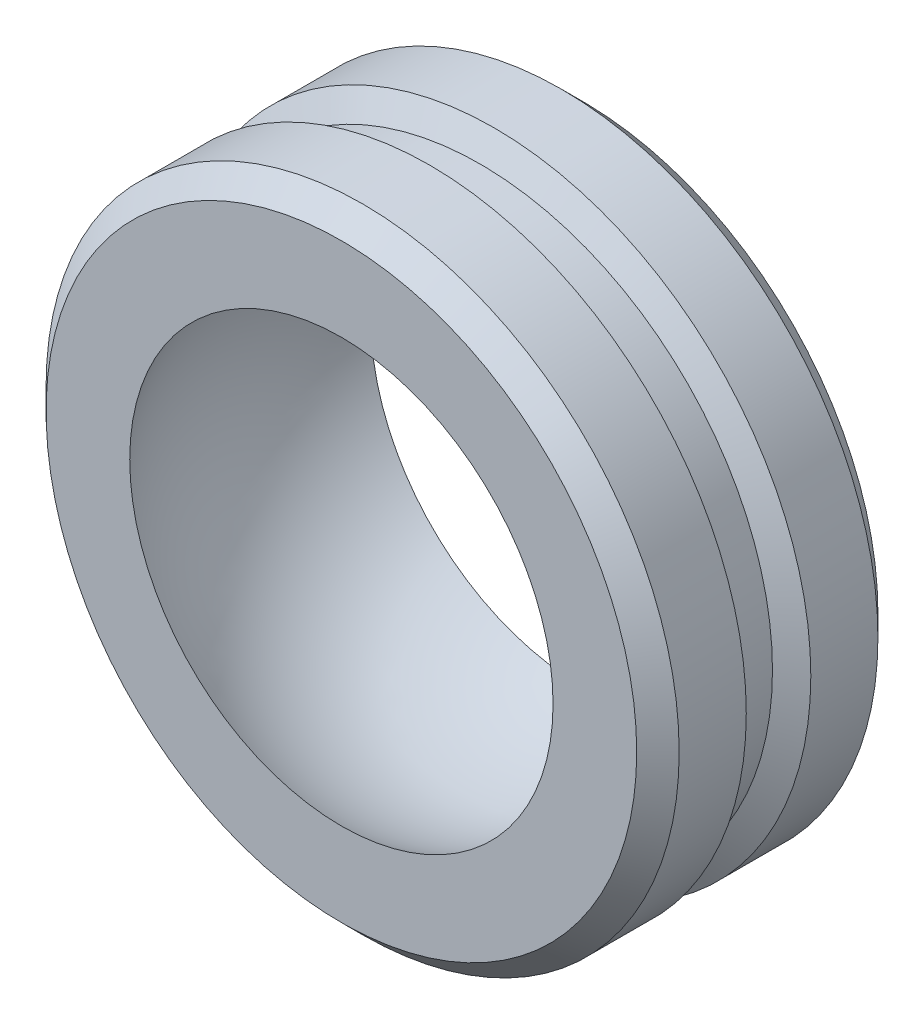
ISO-10303-21;
HEADER;
FILE_DESCRIPTION(('STEP AP214'),'2;1');
FILE_NAME('part.step','',(''),(''),'','','');
FILE_SCHEMA(('AUTOMOTIVE_DESIGN { 1 0 10303 214 1 1 1 1 }'));
ENDSEC;
DATA;
#1=APPLICATION_CONTEXT('core data for automotive mechanical design processes');
#2=APPLICATION_PROTOCOL_DEFINITION('international standard','automotive_design',2000,#1);
#3=PRODUCT_CONTEXT('',#1,'mechanical');
#4=PRODUCT('Part','Part','',(#3));
#5=PRODUCT_RELATED_PRODUCT_CATEGORY('part','',(#4));
#6=PRODUCT_DEFINITION_FORMATION('','',#4);
#7=PRODUCT_DEFINITION_CONTEXT('part definition',#1,'design');
#8=PRODUCT_DEFINITION('design','',#6,#7);
#9=PRODUCT_DEFINITION_SHAPE('','',#8);
#10=(LENGTH_UNIT() NAMED_UNIT(*) SI_UNIT(.MILLI.,.METRE.));
#11=(NAMED_UNIT(*) PLANE_ANGLE_UNIT() SI_UNIT($,.RADIAN.));
#12=(NAMED_UNIT(*) SI_UNIT($,.STERADIAN.) SOLID_ANGLE_UNIT());
#13=UNCERTAINTY_MEASURE_WITH_UNIT(LENGTH_MEASURE(1.E-05),#10,'distance_accuracy_value','');
#14=(GEOMETRIC_REPRESENTATION_CONTEXT(3) GLOBAL_UNCERTAINTY_ASSIGNED_CONTEXT((#13)) GLOBAL_UNIT_ASSIGNED_CONTEXT((#10,
#11,#12)) REPRESENTATION_CONTEXT('',''));
#15=CARTESIAN_POINT('',(0.,0.,0.));
#16=DIRECTION('',(0.,0.,1.));
#17=DIRECTION('',(1.,0.,0.));
#18=AXIS2_PLACEMENT_3D('',#15,#16,#17);
#19=CARTESIAN_POINT('',(0.,0.,3.175));
#20=DIRECTION('',(0.,0.,-1.));
#21=DIRECTION('',(-1.,0.,0.));
#22=AXIS2_PLACEMENT_3D('',#19,#20,#21);
#23=CYLINDRICAL_SURFACE('',#22,8.33374);
#24=CARTESIAN_POINT('',(0.,0.,2.6162));
#25=DIRECTION('',(0.,0.,1.));
#26=DIRECTION('',(1.,0.,0.));
#27=AXIS2_PLACEMENT_3D('',#24,#25,#26);
#28=CIRCLE('',#27,8.33374);
#29=CARTESIAN_POINT('',(8.33374,0.,2.6162));
#30=VERTEX_POINT('',#29);
#31=EDGE_CURVE('E41',#30,#30,#28,.F.);
#32=ORIENTED_EDGE('',*,*,#31,.T.);
#33=EDGE_LOOP('',(#32));
#34=FACE_BOUND('',#33,.T.);
#35=CARTESIAN_POINT('',(0.,0.,0.849610360302894));
#36=DIRECTION('',(0.,0.,1.));
#37=DIRECTION('',(1.,0.,0.));
#38=AXIS2_PLACEMENT_3D('',#35,#36,#37);
#39=CIRCLE('',#38,8.33374);
#40=CARTESIAN_POINT('',(8.33374,0.,0.849610360302894));
#41=VERTEX_POINT('',#40);
#42=EDGE_CURVE('E58',#41,#41,#39,.T.);
#43=ORIENTED_EDGE('',*,*,#42,.T.);
#44=EDGE_LOOP('',(#43));
#45=FACE_BOUND('',#44,.T.);
#46=ADVANCED_FACE('F34',(#34,#45),#23,.T.);
#47=CARTESIAN_POINT('',(0.,0.,-2.6162));
#48=DIRECTION('',(0.,0.,1.));
#49=DIRECTION('',(1.,0.,0.));
#50=AXIS2_PLACEMENT_3D('',#47,#48,#49);
#51=CIRCLE('',#50,8.33374);
#52=CARTESIAN_POINT('',(8.33374,0.,-2.6162));
#53=VERTEX_POINT('',#52);
#54=EDGE_CURVE('E45',#53,#53,#51,.T.);
#55=ORIENTED_EDGE('',*,*,#54,.T.);
#56=EDGE_LOOP('',(#55));
#57=FACE_BOUND('',#56,.T.);
#58=CARTESIAN_POINT('',(0.,0.,-0.849610360302894));
#59=DIRECTION('',(0.,0.,1.));
#60=DIRECTION('',(1.,0.,0.));
#61=AXIS2_PLACEMENT_3D('',#58,#59,#60);
#62=CIRCLE('',#61,8.33374);
#63=CARTESIAN_POINT('',(8.33374,0.,-0.849610360302894));
#64=VERTEX_POINT('',#63);
#65=EDGE_CURVE('E69',#64,#64,#62,.T.);
#66=ORIENTED_EDGE('',*,*,#65,.F.);
#67=EDGE_LOOP('',(#66));
#68=FACE_BOUND('',#67,.T.);
#69=ADVANCED_FACE('F76',(#57,#68),#23,.T.);
#70=CARTESIAN_POINT('',(0.,0.,3.175));
#71=DIRECTION('',(0.,0.,1.));
#72=DIRECTION('',(1.,0.,0.));
#73=AXIS2_PLACEMENT_3D('',#70,#71,#72);
#74=PLANE('',#73);
#75=CARTESIAN_POINT('',(0.,0.,3.175));
#76=DIRECTION('',(0.,0.,1.));
#77=DIRECTION('',(1.,0.,0.));
#78=AXIS2_PLACEMENT_3D('',#75,#76,#77);
#79=CIRCLE('',#78,7.77494);
#80=CARTESIAN_POINT('',(7.77494,0.,3.175));
#81=VERTEX_POINT('',#80);
#82=EDGE_CURVE('E49',#81,#81,#79,.T.);
#83=ORIENTED_EDGE('',*,*,#82,.T.);
#84=EDGE_LOOP('',(#83));
#85=FACE_BOUND('',#84,.T.);
#86=CARTESIAN_POINT('',(0.,0.,3.175));
#87=DIRECTION('',(0.,0.,1.));
#88=DIRECTION('',(1.,0.,0.));
#89=AXIS2_PLACEMENT_3D('',#86,#87,#88);
#90=CIRCLE('',#89,5.57246419907746);
#91=CARTESIAN_POINT('',(5.57246419907746,0.,3.175));
#92=VERTEX_POINT('',#91);
#93=EDGE_CURVE('E54',#92,#92,#90,.T.);
#94=ORIENTED_EDGE('',*,*,#93,.F.);
#95=EDGE_LOOP('',(#94));
#96=FACE_BOUND('',#95,.T.);
#97=ADVANCED_FACE('F78',(#85,#96),#74,.T.);
#98=CARTESIAN_POINT('',(0.,0.,-3.175));
#99=DIRECTION('',(0.,0.,1.));
#100=DIRECTION('',(1.,0.,0.));
#101=AXIS2_PLACEMENT_3D('',#98,#99,#100);
#102=PLANE('',#101);
#103=CARTESIAN_POINT('',(0.,0.,-3.175));
#104=DIRECTION('',(0.,0.,1.));
#105=DIRECTION('',(1.,0.,0.));
#106=AXIS2_PLACEMENT_3D('',#103,#104,#105);
#107=CIRCLE('',#106,7.77494);
#108=CARTESIAN_POINT('',(7.77494,0.,-3.175));
#109=VERTEX_POINT('',#108);
#110=EDGE_CURVE('E10',#109,#109,#107,.F.);
#111=ORIENTED_EDGE('',*,*,#110,.T.);
#112=EDGE_LOOP('',(#111));
#113=FACE_BOUND('',#112,.T.);
#114=CARTESIAN_POINT('',(0.,0.,-3.175));
#115=DIRECTION('',(0.,0.,1.));
#116=DIRECTION('',(1.,0.,0.));
#117=AXIS2_PLACEMENT_3D('',#114,#115,#116);
#118=CIRCLE('',#117,5.57246419907746);
#119=CARTESIAN_POINT('',(5.57246419907746,0.,-3.175));
#120=VERTEX_POINT('',#119);
#121=EDGE_CURVE('E55',#120,#120,#118,.T.);
#122=ORIENTED_EDGE('',*,*,#121,.T.);
#123=EDGE_LOOP('',(#122));
#124=FACE_BOUND('',#123,.T.);
#125=ADVANCED_FACE('F85',(#113,#124),#102,.F.);
#126=CARTESIAN_POINT('',(0.,0.,0.));
#127=DIRECTION('',(0.,-1.,0.));
#128=DIRECTION('',(-1.,0.,0.));
#129=AXIS2_PLACEMENT_3D('',#126,#127,#128);
#130=SPHERICAL_SURFACE('',#129,6.4135);
#131=CARTESIAN_POINT('',(0.,0.,0.));
#132=DIRECTION('',(0.,0.,1.));
#133=DIRECTION('',(1.,0.,0.));
#134=AXIS2_PLACEMENT_3D('',#131,#132,#133);
#135=SPHERICAL_SURFACE('',#134,6.4135);
#136=ORIENTED_EDGE('',*,*,#93,.T.);
#137=EDGE_LOOP('',(#136));
#138=FACE_BOUND('',#137,.T.);
#139=ORIENTED_EDGE('',*,*,#121,.F.);
#140=EDGE_LOOP('',(#139));
#141=FACE_BOUND('',#140,.T.);
#142=ADVANCED_FACE('F91',(#138,#141),#135,.F.);
#143=CARTESIAN_POINT('',(0.,0.,3.175));
#144=DIRECTION('',(0.,0.,-1.));
#145=DIRECTION('',(-1.,0.,0.));
#146=AXIS2_PLACEMENT_3D('',#143,#144,#145);
#147=CONICAL_SURFACE('',#146,7.77494,0.785398163397446);
#148=ORIENTED_EDGE('',*,*,#31,.F.);
#149=EDGE_LOOP('',(#148));
#150=FACE_BOUND('',#149,.T.);
#151=ORIENTED_EDGE('',*,*,#82,.F.);
#152=EDGE_LOOP('',(#151));
#153=FACE_BOUND('',#152,.T.);
#154=ADVANCED_FACE('F89',(#150,#153),#147,.T.);
#155=CARTESIAN_POINT('',(0.,0.,-2.6162));
#156=DIRECTION('',(0.,0.,1.));
#157=DIRECTION('',(1.,0.,0.));
#158=AXIS2_PLACEMENT_3D('',#155,#156,#157);
#159=CONICAL_SURFACE('',#158,8.33374,0.785398163397449);
#160=ORIENTED_EDGE('',*,*,#110,.F.);
#161=EDGE_LOOP('',(#160));
#162=FACE_BOUND('',#161,.T.);
#163=ORIENTED_EDGE('',*,*,#54,.F.);
#164=EDGE_LOOP('',(#163));
#165=FACE_BOUND('',#164,.T.);
#166=ADVANCED_FACE('F36',(#162,#165),#159,.T.);
#167=CARTESIAN_POINT('',(0.,0.,0.849610360302894));
#168=DIRECTION('',(0.,0.,1.));
#169=DIRECTION('',(1.,0.,0.));
#170=AXIS2_PLACEMENT_3D('',#167,#168,#169);
#171=CONICAL_SURFACE('',#170,8.33374,1.0471975511966);
#172=CARTESIAN_POINT('',(0.,0.,0.48006));
#173=DIRECTION('',(0.,0.,1.));
#174=DIRECTION('',(1.,0.,0.));
#175=AXIS2_PLACEMENT_3D('',#172,#173,#174);
#176=CIRCLE('',#175,7.69366);
#177=CARTESIAN_POINT('',(7.69366,0.,0.48006));
#178=VERTEX_POINT('',#177);
#179=EDGE_CURVE('E63',#178,#178,#176,.T.);
#180=ORIENTED_EDGE('',*,*,#179,.T.);
#181=EDGE_LOOP('',(#180));
#182=FACE_BOUND('',#181,.T.);
#183=ORIENTED_EDGE('',*,*,#42,.F.);
#184=EDGE_LOOP('',(#183));
#185=FACE_BOUND('',#184,.T.);
#186=ADVANCED_FACE('F97',(#182,#185),#171,.T.);
#187=CARTESIAN_POINT('',(0.,0.,0.));
#188=DIRECTION('',(0.,0.,1.));
#189=DIRECTION('',(1.,0.,0.));
#190=AXIS2_PLACEMENT_3D('',#187,#188,#189);
#191=CYLINDRICAL_SURFACE('',#190,7.69366);
#192=CARTESIAN_POINT('',(0.,0.,-0.48006));
#193=DIRECTION('',(0.,0.,1.));
#194=DIRECTION('',(1.,0.,0.));
#195=AXIS2_PLACEMENT_3D('',#192,#193,#194);
#196=CIRCLE('',#195,7.69366);
#197=CARTESIAN_POINT('',(7.69366,0.,-0.48006));
#198=VERTEX_POINT('',#197);
#199=EDGE_CURVE('E66',#198,#198,#196,.T.);
#200=ORIENTED_EDGE('',*,*,#199,.T.);
#201=EDGE_LOOP('',(#200));
#202=FACE_BOUND('',#201,.T.);
#203=ORIENTED_EDGE('',*,*,#179,.F.);
#204=EDGE_LOOP('',(#203));
#205=FACE_BOUND('',#204,.T.);
#206=ADVANCED_FACE('F151',(#202,#205),#191,.T.);
#207=CARTESIAN_POINT('',(0.,0.,-0.48006));
#208=DIRECTION('',(0.,0.,-1.));
#209=DIRECTION('',(-1.,0.,0.));
#210=AXIS2_PLACEMENT_3D('',#207,#208,#209);
#211=CONICAL_SURFACE('',#210,7.69366,1.0471975511966);
#212=ORIENTED_EDGE('',*,*,#65,.T.);
#213=EDGE_LOOP('',(#212));
#214=FACE_BOUND('',#213,.T.);
#215=ORIENTED_EDGE('',*,*,#199,.F.);
#216=EDGE_LOOP('',(#215));
#217=FACE_BOUND('',#216,.T.);
#218=ADVANCED_FACE('F73',(#214,#217),#211,.T.);
#219=CLOSED_SHELL('',(#46,#69,#97,#125,#142,#154,#166,#186,#206,#218));
#220=MANIFOLD_SOLID_BREP('B2',#219);
#221=ADVANCED_BREP_SHAPE_REPRESENTATION('',(#18,#220),#14);
#222=SHAPE_DEFINITION_REPRESENTATION(#9,#221);
ENDSEC;
END-ISO-10303-21;
